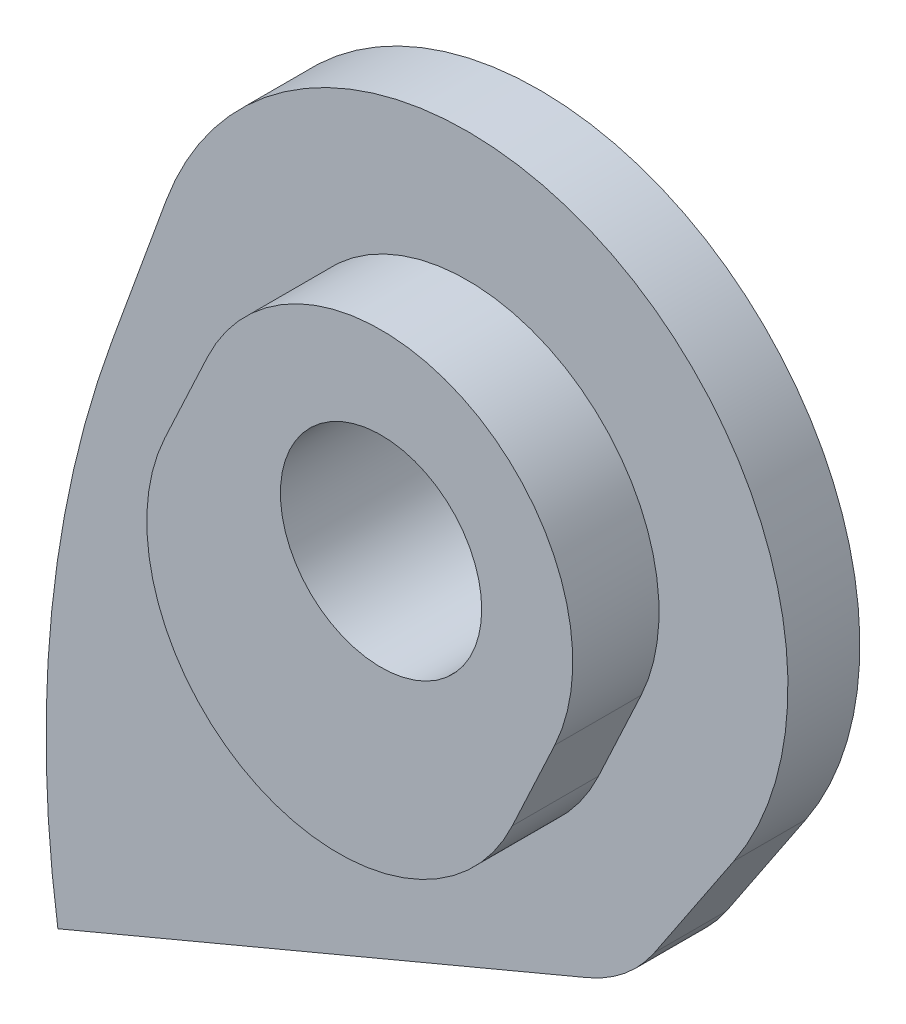
ISO-10303-21;
HEADER;
FILE_DESCRIPTION(('STEP AP214'),'2;1');
FILE_NAME('part.step','',(''),(''),'','','');
FILE_SCHEMA(('AUTOMOTIVE_DESIGN { 1 0 10303 214 1 1 1 1 }'));
ENDSEC;
DATA;
#1=APPLICATION_CONTEXT('core data for automotive mechanical design processes');
#2=APPLICATION_PROTOCOL_DEFINITION('international standard','automotive_design',2000,#1);
#3=PRODUCT_CONTEXT('',#1,'mechanical');
#4=PRODUCT('Part','Part','',(#3));
#5=PRODUCT_RELATED_PRODUCT_CATEGORY('part','',(#4));
#6=PRODUCT_DEFINITION_FORMATION('','',#4);
#7=PRODUCT_DEFINITION_CONTEXT('part definition',#1,'design');
#8=PRODUCT_DEFINITION('design','',#6,#7);
#9=PRODUCT_DEFINITION_SHAPE('','',#8);
#10=(LENGTH_UNIT() NAMED_UNIT(*) SI_UNIT(.MILLI.,.METRE.));
#11=(NAMED_UNIT(*) PLANE_ANGLE_UNIT() SI_UNIT($,.RADIAN.));
#12=(NAMED_UNIT(*) SI_UNIT($,.STERADIAN.) SOLID_ANGLE_UNIT());
#13=UNCERTAINTY_MEASURE_WITH_UNIT(LENGTH_MEASURE(1.E-05),#10,'distance_accuracy_value','');
#14=(GEOMETRIC_REPRESENTATION_CONTEXT(3) GLOBAL_UNCERTAINTY_ASSIGNED_CONTEXT((#13)) GLOBAL_UNIT_ASSIGNED_CONTEXT((#10,
#11,#12)) REPRESENTATION_CONTEXT('',''));
#15=CARTESIAN_POINT('',(0.,0.,0.));
#16=DIRECTION('',(0.,0.,1.));
#17=DIRECTION('',(1.,0.,0.));
#18=AXIS2_PLACEMENT_3D('',#15,#16,#17);
#19=CARTESIAN_POINT('',(0.11468761398859,80.1325343968941,0.));
#20=DIRECTION('',(0.,0.,1.));
#21=DIRECTION('',(1.,0.,0.));
#22=AXIS2_PLACEMENT_3D('',#19,#20,#21);
#23=PLANE('',#22);
#24=CARTESIAN_POINT('',(14.2795120747355,71.4970986035797,0.));
#25=DIRECTION('',(0.,0.,1.));
#26=DIRECTION('',(1.,0.,0.));
#27=AXIS2_PLACEMENT_3D('',#24,#25,#26);
#28=CIRCLE('',#27,22.9540740082007);
#29=CARTESIAN_POINT('',(-7.29026188774433,79.3478542857725,0.));
#30=VERTEX_POINT('',#29);
#31=CARTESIAN_POINT('',(-8.42769677737512,68.1396919078421,0.));
#32=VERTEX_POINT('',#31);
#33=EDGE_CURVE('E154',#30,#32,#28,.T.);
#34=ORIENTED_EDGE('',*,*,#33,.T.);
#35=DIRECTION('',(-0.921960246209325,-0.387284526426812,0.));
#36=VECTOR('',#35,1.);
#37=CARTESIAN_POINT('',(2.62584420432856,72.7829131335289,0.));
#38=LINE('',#37,#36);
#39=CARTESIAN_POINT('',(2.62584420432857,72.7829131335288,0.));
#40=VERTEX_POINT('',#39);
#41=EDGE_CURVE('E178',#40,#32,#38,.T.);
#42=ORIENTED_EDGE('',*,*,#41,.F.);
#43=CARTESIAN_POINT('',(1.41064938117233,75.6757767567832,0.));
#44=DIRECTION('',(0.,0.,-1.));
#45=DIRECTION('',(-1.,0.,0.));
#46=AXIS2_PLACEMENT_3D('',#43,#44,#45);
#47=CIRCLE('',#46,3.13773140994799);
#48=CARTESIAN_POINT('',(4.02035151590427,73.933705240183,0.));
#49=VERTEX_POINT('',#48);
#50=EDGE_CURVE('E173',#49,#40,#47,.T.);
#51=ORIENTED_EDGE('',*,*,#50,.F.);
#52=DIRECTION('',(0.555200968150768,0.831716228628761,0.));
#53=VECTOR('',#52,1.);
#54=CARTESIAN_POINT('',(4.02035151590429,73.933705240183,0.));
#55=LINE('',#54,#53);
#56=CARTESIAN_POINT('',(5.67886918351501,76.4182399199654,0.));
#57=VERTEX_POINT('',#56);
#58=EDGE_CURVE('E147',#49,#57,#55,.T.);
#59=ORIENTED_EDGE('',*,*,#58,.T.);
#60=CARTESIAN_POINT('',(0.11468761398859,80.1325343968941,0.));
#61=DIRECTION('',(0.,0.,1.));
#62=DIRECTION('',(1.,0.,0.));
#63=AXIS2_PLACEMENT_3D('',#60,#61,#62);
#64=CIRCLE('',#63,6.69000000000006);
#65=CARTESIAN_POINT('',(-6.17185601906935,82.4206491557424,0.));
#66=VERTEX_POINT('',#65);
#67=EDGE_CURVE('E149',#57,#66,#64,.T.);
#68=ORIENTED_EDGE('',*,*,#67,.T.);
#69=DIRECTION('',(-0.342020143325666,-0.939692620785909,0.));
#70=VECTOR('',#69,1.);
#71=CARTESIAN_POINT('',(-6.1718560190694,82.4206491557424,0.));
#72=LINE('',#71,#70);
#73=EDGE_CURVE('E155',#66,#30,#72,.T.);
#74=ORIENTED_EDGE('',*,*,#73,.T.);
#75=EDGE_LOOP('',(#34,#42,#51,#59,#68,#74));
#76=FACE_BOUND('',#75,.T.);
#77=DIRECTION('',(-0.4226182617407,-0.90630778703665,0.));
#78=VECTOR('',#77,1.);
#79=CARTESIAN_POINT('',(-3.51054353415801,81.8230074438569,0.));
#80=LINE('',#79,#78);
#81=CARTESIAN_POINT('',(-3.51054353415801,81.8230074438569,0.));
#82=VERTEX_POINT('',#81);
#83=CARTESIAN_POINT('',(-4.39804188381347,79.9197610910799,0.));
#84=VERTEX_POINT('',#83);
#85=EDGE_CURVE('E241',#82,#84,#80,.T.);
#86=ORIENTED_EDGE('',*,*,#85,.F.);
#87=CARTESIAN_POINT('',(0.114687613988609,80.1325343968941,0.));
#88=DIRECTION('',(0.,0.,1.));
#89=DIRECTION('',(1.,0.,0.));
#90=AXIS2_PLACEMENT_3D('',#87,#88,#89);
#91=CIRCLE('',#90,4.00000000000001);
#92=CARTESIAN_POINT('',(3.73991876213519,78.4420613499313,0.));
#93=VERTEX_POINT('',#92);
#94=EDGE_CURVE('E145',#93,#82,#91,.T.);
#95=ORIENTED_EDGE('',*,*,#94,.F.);
#96=DIRECTION('',(0.4226182617407,0.90630778703665,0.));
#97=VECTOR('',#96,1.);
#98=CARTESIAN_POINT('',(3.73991876213519,78.4420613499313,0.));
#99=LINE('',#98,#97);
#100=CARTESIAN_POINT('',(2.85242041247973,76.5388149971543,0.));
#101=VERTEX_POINT('',#100);
#102=EDGE_CURVE('E141',#101,#93,#99,.T.);
#103=ORIENTED_EDGE('',*,*,#102,.F.);
#104=CARTESIAN_POINT('',(-0.772810735666862,78.2292880441171,0.));
#105=DIRECTION('',(0.,0.,1.));
#106=DIRECTION('',(1.,0.,0.));
#107=AXIS2_PLACEMENT_3D('',#104,#105,#106);
#108=CIRCLE('',#107,4.00000000000001);
#109=EDGE_CURVE('E243',#84,#101,#108,.T.);
#110=ORIENTED_EDGE('',*,*,#109,.F.);
#111=EDGE_LOOP('',(#86,#95,#103,#110));
#112=FACE_BOUND('',#111,.T.);
#113=ADVANCED_FACE('F33',(#76,#112),#23,.T.);
#114=CARTESIAN_POINT('',(-8.01359795678153,76.9658058271043,-4.5));
#115=DIRECTION('',(-0.921960246209324,-0.387284526426815,0.));
#116=DIRECTION('',(0.387284526426815,-0.921960246209324,0.));
#117=AXIS2_PLACEMENT_3D('',#114,#115,#116);
#118=PLANE('',#117);
#119=DIRECTION('',(0.387284526426815,-0.921960246209324,0.));
#120=VECTOR('',#119,1.);
#121=CARTESIAN_POINT('',(-8.01359795678153,76.9658058271043,-1.5));
#122=LINE('',#121,#120);
#123=CARTESIAN_POINT('',(-8.01359795678153,76.9658058271043,-1.5));
#124=VERTEX_POINT('',#123);
#125=CARTESIAN_POINT('',(-4.92424784177968,69.611373108264,-1.5));
#126=VERTEX_POINT('',#125);
#127=EDGE_CURVE('E56',#124,#126,#122,.T.);
#128=ORIENTED_EDGE('',*,*,#127,.T.);
#129=DIRECTION('',(0.,0.,1.));
#130=VECTOR('',#129,1.);
#131=CARTESIAN_POINT('',(-4.92424784177968,69.611373108264,-4.5));
#132=LINE('',#131,#130);
#133=CARTESIAN_POINT('',(-4.92424784177968,69.611373108264,-4.5));
#134=VERTEX_POINT('',#133);
#135=EDGE_CURVE('E166',#134,#126,#132,.T.);
#136=ORIENTED_EDGE('',*,*,#135,.F.);
#137=DIRECTION('',(0.387284526426815,-0.921960246209324,0.));
#138=VECTOR('',#137,1.);
#139=CARTESIAN_POINT('',(-8.01359795678153,76.9658058271043,-4.5));
#140=LINE('',#139,#138);
#141=CARTESIAN_POINT('',(-8.01359795678153,76.9658058271043,-4.5));
#142=VERTEX_POINT('',#141);
#143=EDGE_CURVE('E164',#142,#134,#140,.T.);
#144=ORIENTED_EDGE('',*,*,#143,.F.);
#145=DIRECTION('',(0.,0.,1.));
#146=VECTOR('',#145,1.);
#147=CARTESIAN_POINT('',(-8.01359795678153,76.9658058271043,-4.5));
#148=LINE('',#147,#146);
#149=EDGE_CURVE('E170',#142,#124,#148,.T.);
#150=ORIENTED_EDGE('',*,*,#149,.T.);
#151=EDGE_LOOP('',(#128,#136,#144,#150));
#152=FACE_BOUND('',#151,.T.);
#153=ADVANCED_FACE('F230',(#152),#118,.F.);
#154=CARTESIAN_POINT('',(14.2795120747355,71.4970986035797,-4.5));
#155=DIRECTION('',(0.,0.,1.));
#156=DIRECTION('',(1.,0.,0.));
#157=AXIS2_PLACEMENT_3D('',#154,#155,#156);
#158=PLANE('',#157);
#159=DIRECTION('',(-0.921960246209326,-0.38728452642681,0.));
#160=VECTOR('',#159,1.);
#161=CARTESIAN_POINT('',(-4.92424784177968,69.611373108264,-4.5));
#162=LINE('',#161,#160);
#163=CARTESIAN_POINT('',(-8.42769677737511,68.1396919078421,-4.5));
#164=VERTEX_POINT('',#163);
#165=EDGE_CURVE('E159',#134,#164,#162,.T.);
#166=ORIENTED_EDGE('',*,*,#165,.T.);
#167=CARTESIAN_POINT('',(14.2795120747355,71.4970986035797,-4.5));
#168=DIRECTION('',(0.,0.,-1.));
#169=DIRECTION('',(1.,0.,0.));
#170=AXIS2_PLACEMENT_3D('',#167,#168,#169);
#171=CIRCLE('',#170,22.9540740082007);
#172=EDGE_CURVE('E162',#164,#142,#171,.T.);
#173=ORIENTED_EDGE('',*,*,#172,.T.);
#174=ORIENTED_EDGE('',*,*,#143,.T.);
#175=EDGE_LOOP('',(#166,#173,#174));
#176=FACE_BOUND('',#175,.T.);
#177=ADVANCED_FACE('F281',(#176),#158,.F.);
#178=CARTESIAN_POINT('',(0.11468761398859,80.1325343968941,-1.5));
#179=DIRECTION('',(0.,0.,1.));
#180=DIRECTION('',(1.,0.,0.));
#181=AXIS2_PLACEMENT_3D('',#178,#179,#180);
#182=PLANE('',#181);
#183=CARTESIAN_POINT('',(0.11468761398859,80.1325343968941,-1.5));
#184=DIRECTION('',(0.,0.,1.));
#185=DIRECTION('',(1.,0.,0.));
#186=AXIS2_PLACEMENT_3D('',#183,#184,#185);
#187=CIRCLE('',#186,2.10000000000001);
#188=CARTESIAN_POINT('',(2.2146876139886,80.1325343968941,-1.5));
#189=VERTEX_POINT('',#188);
#190=EDGE_CURVE('E246',#189,#189,#187,.T.);
#191=ORIENTED_EDGE('',*,*,#190,.T.);
#192=EDGE_LOOP('',(#191));
#193=FACE_BOUND('',#192,.T.);
#194=ORIENTED_EDGE('',*,*,#127,.F.);
#195=CARTESIAN_POINT('',(14.2795120747355,71.4970986035797,-1.5));
#196=DIRECTION('',(0.,0.,-1.));
#197=DIRECTION('',(-1.,0.,0.));
#198=AXIS2_PLACEMENT_3D('',#195,#196,#197);
#199=CIRCLE('',#198,22.9540740082007);
#200=CARTESIAN_POINT('',(-7.29026188774433,79.3478542857725,-1.5));
#201=VERTEX_POINT('',#200);
#202=EDGE_CURVE('E184',#124,#201,#199,.T.);
#203=ORIENTED_EDGE('',*,*,#202,.T.);
#204=DIRECTION('',(0.342020143325687,0.939692620785902,0.));
#205=VECTOR('',#204,1.);
#206=CARTESIAN_POINT('',(-6.17185601906934,82.4206491557424,-1.5));
#207=LINE('',#206,#205);
#208=CARTESIAN_POINT('',(-6.17185601906934,82.4206491557424,-1.5));
#209=VERTEX_POINT('',#208);
#210=EDGE_CURVE('E186',#201,#209,#207,.T.);
#211=ORIENTED_EDGE('',*,*,#210,.T.);
#212=CARTESIAN_POINT('',(0.11468761398859,80.1325343968941,-1.5));
#213=DIRECTION('',(0.,0.,-1.));
#214=DIRECTION('',(1.,0.,0.));
#215=AXIS2_PLACEMENT_3D('',#212,#213,#214);
#216=CIRCLE('',#215,6.69000000000002);
#217=CARTESIAN_POINT('',(5.67886918351501,76.4182399199654,-1.5));
#218=VERTEX_POINT('',#217);
#219=EDGE_CURVE('E174',#209,#218,#216,.T.);
#220=ORIENTED_EDGE('',*,*,#219,.T.);
#221=DIRECTION('',(-0.555200968150769,-0.83171622862876,0.));
#222=VECTOR('',#221,1.);
#223=CARTESIAN_POINT('',(5.67886918351501,76.4182399199654,-1.5));
#224=LINE('',#223,#222);
#225=CARTESIAN_POINT('',(4.02035151590429,73.933705240183,-1.5));
#226=VERTEX_POINT('',#225);
#227=EDGE_CURVE('E177',#218,#226,#224,.T.);
#228=ORIENTED_EDGE('',*,*,#227,.T.);
#229=CARTESIAN_POINT('',(1.41064938117233,75.6757767567832,-1.5));
#230=DIRECTION('',(0.,0.,-1.));
#231=DIRECTION('',(-1.,0.,0.));
#232=AXIS2_PLACEMENT_3D('',#229,#230,#231);
#233=CIRCLE('',#232,3.13773140994799);
#234=CARTESIAN_POINT('',(2.62584420432857,72.7829131335288,-1.5));
#235=VERTEX_POINT('',#234);
#236=EDGE_CURVE('E180',#226,#235,#233,.T.);
#237=ORIENTED_EDGE('',*,*,#236,.T.);
#238=DIRECTION('',(-0.921960246209325,-0.387284526426812,0.));
#239=VECTOR('',#238,1.);
#240=CARTESIAN_POINT('',(2.62584420432856,72.7829131335289,-1.5));
#241=LINE('',#240,#239);
#242=EDGE_CURVE('E182',#235,#126,#241,.T.);
#243=ORIENTED_EDGE('',*,*,#242,.T.);
#244=EDGE_LOOP('',(#194,#203,#211,#220,#228,#237,#243));
#245=FACE_BOUND('',#244,.T.);
#246=ADVANCED_FACE('F212',(#193,#245),#182,.F.);
#247=CARTESIAN_POINT('',(1.41064938117233,75.6757767567832,-1.5));
#248=DIRECTION('',(0.,0.,1.));
#249=DIRECTION('',(1.,0.,0.));
#250=AXIS2_PLACEMENT_3D('',#247,#248,#249);
#251=CYLINDRICAL_SURFACE('',#250,3.13773140994799);
#252=ORIENTED_EDGE('',*,*,#50,.T.);
#253=DIRECTION('',(0.,0.,1.));
#254=VECTOR('',#253,1.);
#255=CARTESIAN_POINT('',(2.62584420432857,72.7829131335288,-1.5));
#256=LINE('',#255,#254);
#257=EDGE_CURVE('E196',#235,#40,#256,.T.);
#258=ORIENTED_EDGE('',*,*,#257,.F.);
#259=ORIENTED_EDGE('',*,*,#236,.F.);
#260=DIRECTION('',(0.,0.,1.));
#261=VECTOR('',#260,1.);
#262=CARTESIAN_POINT('',(4.02035151590429,73.933705240183,-1.5));
#263=LINE('',#262,#261);
#264=EDGE_CURVE('E199',#226,#49,#263,.T.);
#265=ORIENTED_EDGE('',*,*,#264,.T.);
#266=EDGE_LOOP('',(#252,#258,#259,#265));
#267=FACE_BOUND('',#266,.T.);
#268=ADVANCED_FACE('F223',(#267),#251,.T.);
#269=CARTESIAN_POINT('',(2.62584420432856,72.7829131335289,-1.5));
#270=DIRECTION('',(-0.387284526426812,0.921960246209325,0.));
#271=DIRECTION('',(-0.921960246209325,-0.387284526426812,0.));
#272=AXIS2_PLACEMENT_3D('',#269,#270,#271);
#273=PLANE('',#272);
#274=ORIENTED_EDGE('',*,*,#41,.T.);
#275=DIRECTION('',(0.,0.,1.));
#276=VECTOR('',#275,1.);
#277=CARTESIAN_POINT('',(-8.42769677737511,68.1396919078421,-1.5));
#278=LINE('',#277,#276);
#279=EDGE_CURVE('E189',#164,#32,#278,.T.);
#280=ORIENTED_EDGE('',*,*,#279,.F.);
#281=ORIENTED_EDGE('',*,*,#165,.F.);
#282=ORIENTED_EDGE('',*,*,#135,.T.);
#283=ORIENTED_EDGE('',*,*,#242,.F.);
#284=ORIENTED_EDGE('',*,*,#257,.T.);
#285=EDGE_LOOP('',(#274,#280,#281,#282,#283,#284));
#286=FACE_BOUND('',#285,.T.);
#287=ADVANCED_FACE('F225',(#286),#273,.F.);
#288=CARTESIAN_POINT('',(14.2795120747355,71.4970986035797,11.));
#289=DIRECTION('',(0.,0.,-1.));
#290=DIRECTION('',(-1.,0.,0.));
#291=AXIS2_PLACEMENT_3D('',#288,#289,#290);
#292=CYLINDRICAL_SURFACE('',#291,22.9540740082007);
#293=ORIENTED_EDGE('',*,*,#33,.F.);
#294=DIRECTION('',(0.,0.,-1.));
#295=VECTOR('',#294,1.);
#296=CARTESIAN_POINT('',(-7.29026188774433,79.3478542857725,11.));
#297=LINE('',#296,#295);
#298=EDGE_CURVE('E202',#30,#201,#297,.T.);
#299=ORIENTED_EDGE('',*,*,#298,.T.);
#300=ORIENTED_EDGE('',*,*,#202,.F.);
#301=ORIENTED_EDGE('',*,*,#149,.F.);
#302=ORIENTED_EDGE('',*,*,#172,.F.);
#303=ORIENTED_EDGE('',*,*,#279,.T.);
#304=EDGE_LOOP('',(#293,#299,#300,#301,#302,#303));
#305=FACE_BOUND('',#304,.T.);
#306=ADVANCED_FACE('F235',(#305),#292,.T.);
#307=CARTESIAN_POINT('',(-6.1718560190694,82.4206491557424,11.));
#308=DIRECTION('',(0.939692620785909,-0.342020143325666,0.));
#309=DIRECTION('',(0.342020143325666,0.939692620785909,0.));
#310=AXIS2_PLACEMENT_3D('',#307,#308,#309);
#311=PLANE('',#310);
#312=ORIENTED_EDGE('',*,*,#73,.F.);
#313=DIRECTION('',(0.,0.,-1.));
#314=VECTOR('',#313,1.);
#315=CARTESIAN_POINT('',(-6.17185601906935,82.4206491557424,11.));
#316=LINE('',#315,#314);
#317=EDGE_CURVE('E41',#66,#209,#316,.T.);
#318=ORIENTED_EDGE('',*,*,#317,.T.);
#319=ORIENTED_EDGE('',*,*,#210,.F.);
#320=ORIENTED_EDGE('',*,*,#298,.F.);
#321=EDGE_LOOP('',(#312,#318,#319,#320));
#322=FACE_BOUND('',#321,.T.);
#323=ADVANCED_FACE('F207',(#322),#311,.F.);
#324=CARTESIAN_POINT('',(0.11468761398859,80.1325343968941,11.));
#325=DIRECTION('',(0.,0.,-1.));
#326=DIRECTION('',(-1.,0.,0.));
#327=AXIS2_PLACEMENT_3D('',#324,#325,#326);
#328=CYLINDRICAL_SURFACE('',#327,6.69000000000006);
#329=ORIENTED_EDGE('',*,*,#317,.F.);
#330=ORIENTED_EDGE('',*,*,#67,.F.);
#331=DIRECTION('',(0.,0.,-1.));
#332=VECTOR('',#331,1.);
#333=CARTESIAN_POINT('',(5.67886918351501,76.4182399199654,11.));
#334=LINE('',#333,#332);
#335=EDGE_CURVE('E11',#57,#218,#334,.T.);
#336=ORIENTED_EDGE('',*,*,#335,.T.);
#337=ORIENTED_EDGE('',*,*,#219,.F.);
#338=EDGE_LOOP('',(#329,#330,#336,#337));
#339=FACE_BOUND('',#338,.T.);
#340=ADVANCED_FACE('F213',(#339),#328,.T.);
#341=CARTESIAN_POINT('',(4.02035151590429,73.933705240183,11.));
#342=DIRECTION('',(-0.831716228628761,0.555200968150768,0.));
#343=DIRECTION('',(-0.555200968150768,-0.831716228628761,0.));
#344=AXIS2_PLACEMENT_3D('',#341,#342,#343);
#345=PLANE('',#344);
#346=ORIENTED_EDGE('',*,*,#58,.F.);
#347=ORIENTED_EDGE('',*,*,#264,.F.);
#348=ORIENTED_EDGE('',*,*,#227,.F.);
#349=ORIENTED_EDGE('',*,*,#335,.F.);
#350=EDGE_LOOP('',(#346,#347,#348,#349));
#351=FACE_BOUND('',#350,.T.);
#352=ADVANCED_FACE('F35',(#351),#345,.F.);
#353=CARTESIAN_POINT('',(0.114687613988609,80.1325343968941,1.8));
#354=DIRECTION('',(0.,0.,-1.));
#355=DIRECTION('',(-1.,0.,0.));
#356=AXIS2_PLACEMENT_3D('',#353,#354,#355);
#357=CYLINDRICAL_SURFACE('',#356,4.00000000000001);
#358=ORIENTED_EDGE('',*,*,#94,.T.);
#359=DIRECTION('',(0.,0.,-1.));
#360=VECTOR('',#359,1.);
#361=CARTESIAN_POINT('',(-3.51054353415801,81.8230074438569,1.8));
#362=LINE('',#361,#360);
#363=CARTESIAN_POINT('',(-3.51054353415801,81.8230074438569,1.8));
#364=VERTEX_POINT('',#363);
#365=EDGE_CURVE('E126',#364,#82,#362,.T.);
#366=ORIENTED_EDGE('',*,*,#365,.F.);
#367=CARTESIAN_POINT('',(0.114687613988609,80.1325343968941,1.8));
#368=DIRECTION('',(0.,0.,1.));
#369=DIRECTION('',(1.,0.,0.));
#370=AXIS2_PLACEMENT_3D('',#367,#368,#369);
#371=CIRCLE('',#370,4.00000000000001);
#372=CARTESIAN_POINT('',(3.73991876213519,78.4420613499313,1.8));
#373=VERTEX_POINT('',#372);
#374=EDGE_CURVE('E133',#373,#364,#371,.T.);
#375=ORIENTED_EDGE('',*,*,#374,.F.);
#376=DIRECTION('',(0.,0.,-1.));
#377=VECTOR('',#376,1.);
#378=CARTESIAN_POINT('',(3.73991876213519,78.4420613499313,1.8));
#379=LINE('',#378,#377);
#380=EDGE_CURVE('E251',#373,#93,#379,.T.);
#381=ORIENTED_EDGE('',*,*,#380,.T.);
#382=EDGE_LOOP('',(#358,#366,#375,#381));
#383=FACE_BOUND('',#382,.T.);
#384=ADVANCED_FACE('F143',(#383),#357,.T.);
#385=CARTESIAN_POINT('',(-3.51054353415801,81.8230074438569,1.8));
#386=DIRECTION('',(0.90630778703665,-0.4226182617407,0.));
#387=DIRECTION('',(0.4226182617407,0.90630778703665,0.));
#388=AXIS2_PLACEMENT_3D('',#385,#386,#387);
#389=PLANE('',#388);
#390=ORIENTED_EDGE('',*,*,#85,.T.);
#391=DIRECTION('',(0.,0.,-1.));
#392=VECTOR('',#391,1.);
#393=CARTESIAN_POINT('',(-4.39804188381347,79.9197610910799,1.8));
#394=LINE('',#393,#392);
#395=CARTESIAN_POINT('',(-4.39804188381347,79.9197610910799,1.8));
#396=VERTEX_POINT('',#395);
#397=EDGE_CURVE('E129',#396,#84,#394,.T.);
#398=ORIENTED_EDGE('',*,*,#397,.F.);
#399=DIRECTION('',(-0.4226182617407,-0.90630778703665,0.));
#400=VECTOR('',#399,1.);
#401=CARTESIAN_POINT('',(-3.51054353415801,81.8230074438569,1.8));
#402=LINE('',#401,#400);
#403=EDGE_CURVE('E122',#364,#396,#402,.T.);
#404=ORIENTED_EDGE('',*,*,#403,.F.);
#405=ORIENTED_EDGE('',*,*,#365,.T.);
#406=EDGE_LOOP('',(#390,#398,#404,#405));
#407=FACE_BOUND('',#406,.T.);
#408=ADVANCED_FACE('F124',(#407),#389,.F.);
#409=CARTESIAN_POINT('',(-0.772810735666862,78.2292880441171,1.8));
#410=DIRECTION('',(0.,0.,-1.));
#411=DIRECTION('',(-1.,0.,0.));
#412=AXIS2_PLACEMENT_3D('',#409,#410,#411);
#413=CYLINDRICAL_SURFACE('',#412,4.00000000000001);
#414=ORIENTED_EDGE('',*,*,#109,.T.);
#415=DIRECTION('',(0.,0.,-1.));
#416=VECTOR('',#415,1.);
#417=CARTESIAN_POINT('',(2.85242041247973,76.5388149971543,1.8));
#418=LINE('',#417,#416);
#419=CARTESIAN_POINT('',(2.85242041247973,76.5388149971543,1.8));
#420=VERTEX_POINT('',#419);
#421=EDGE_CURVE('E48',#420,#101,#418,.T.);
#422=ORIENTED_EDGE('',*,*,#421,.F.);
#423=CARTESIAN_POINT('',(-0.772810735666862,78.2292880441171,1.8));
#424=DIRECTION('',(0.,0.,1.));
#425=DIRECTION('',(1.,0.,0.));
#426=AXIS2_PLACEMENT_3D('',#423,#424,#425);
#427=CIRCLE('',#426,4.00000000000001);
#428=EDGE_CURVE('E132',#396,#420,#427,.T.);
#429=ORIENTED_EDGE('',*,*,#428,.F.);
#430=ORIENTED_EDGE('',*,*,#397,.T.);
#431=EDGE_LOOP('',(#414,#422,#429,#430));
#432=FACE_BOUND('',#431,.T.);
#433=ADVANCED_FACE('F271',(#432),#413,.T.);
#434=CARTESIAN_POINT('',(3.73991876213519,78.4420613499313,1.8));
#435=DIRECTION('',(-0.90630778703665,0.4226182617407,0.));
#436=DIRECTION('',(-0.4226182617407,-0.90630778703665,0.));
#437=AXIS2_PLACEMENT_3D('',#434,#435,#436);
#438=PLANE('',#437);
#439=ORIENTED_EDGE('',*,*,#102,.T.);
#440=ORIENTED_EDGE('',*,*,#380,.F.);
#441=DIRECTION('',(0.4226182617407,0.90630778703665,0.));
#442=VECTOR('',#441,1.);
#443=CARTESIAN_POINT('',(3.73991876213519,78.4420613499313,1.8));
#444=LINE('',#443,#442);
#445=EDGE_CURVE('E137',#420,#373,#444,.T.);
#446=ORIENTED_EDGE('',*,*,#445,.F.);
#447=ORIENTED_EDGE('',*,*,#421,.T.);
#448=EDGE_LOOP('',(#439,#440,#446,#447));
#449=FACE_BOUND('',#448,.T.);
#450=ADVANCED_FACE('F264',(#449),#438,.F.);
#451=CARTESIAN_POINT('',(0.114687613988609,80.1325343968941,1.8));
#452=DIRECTION('',(0.,0.,1.));
#453=DIRECTION('',(1.,0.,0.));
#454=AXIS2_PLACEMENT_3D('',#451,#452,#453);
#455=PLANE('',#454);
#456=CARTESIAN_POINT('',(0.11468761398859,80.1325343968941,1.8));
#457=DIRECTION('',(0.,0.,1.));
#458=DIRECTION('',(1.,0.,0.));
#459=AXIS2_PLACEMENT_3D('',#456,#457,#458);
#460=CIRCLE('',#459,2.10000000000001);
#461=CARTESIAN_POINT('',(2.2146876139886,80.1325343968941,1.8));
#462=VERTEX_POINT('',#461);
#463=EDGE_CURVE('E256',#462,#462,#460,.T.);
#464=ORIENTED_EDGE('',*,*,#463,.F.);
#465=EDGE_LOOP('',(#464));
#466=FACE_BOUND('',#465,.T.);
#467=ORIENTED_EDGE('',*,*,#374,.T.);
#468=ORIENTED_EDGE('',*,*,#403,.T.);
#469=ORIENTED_EDGE('',*,*,#428,.T.);
#470=ORIENTED_EDGE('',*,*,#445,.T.);
#471=EDGE_LOOP('',(#467,#468,#469,#470));
#472=FACE_BOUND('',#471,.T.);
#473=ADVANCED_FACE('F136',(#466,#472),#455,.T.);
#474=CARTESIAN_POINT('',(0.11468761398859,80.1325343968941,-4.5));
#475=DIRECTION('',(0.,0.,1.));
#476=DIRECTION('',(1.,0.,0.));
#477=AXIS2_PLACEMENT_3D('',#474,#475,#476);
#478=CYLINDRICAL_SURFACE('',#477,2.10000000000001);
#479=ORIENTED_EDGE('',*,*,#463,.T.);
#480=EDGE_LOOP('',(#479));
#481=FACE_BOUND('',#480,.T.);
#482=ORIENTED_EDGE('',*,*,#190,.F.);
#483=EDGE_LOOP('',(#482));
#484=FACE_BOUND('',#483,.T.);
#485=ADVANCED_FACE('F260',(#481,#484),#478,.F.);
#486=CLOSED_SHELL('',(#113,#153,#177,#246,#268,#287,#306,#323,#340,#352,#384,#408,#433,#450,
#473,#485));
#487=MANIFOLD_SOLID_BREP('B2',#486);
#488=ADVANCED_BREP_SHAPE_REPRESENTATION('',(#18,#487),#14);
#489=SHAPE_DEFINITION_REPRESENTATION(#9,#488);
ENDSEC;
END-ISO-10303-21;
